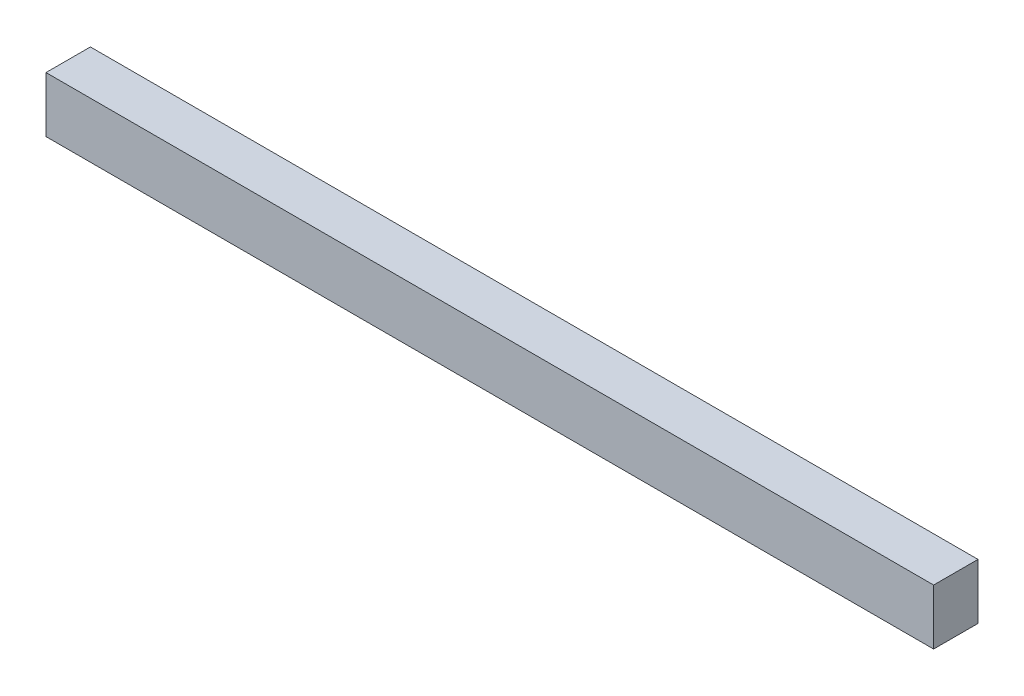
ISO-10303-21;
HEADER;
FILE_DESCRIPTION(('STEP AP214'),'2;1');
FILE_NAME('part.step','',(''),(''),'','','');
FILE_SCHEMA(('AUTOMOTIVE_DESIGN { 1 0 10303 214 1 1 1 1 }'));
ENDSEC;
DATA;
#1=APPLICATION_CONTEXT('core data for automotive mechanical design processes');
#2=APPLICATION_PROTOCOL_DEFINITION('international standard','automotive_design',2000,#1);
#3=PRODUCT_CONTEXT('',#1,'mechanical');
#4=PRODUCT('Part','Part','',(#3));
#5=PRODUCT_RELATED_PRODUCT_CATEGORY('part','',(#4));
#6=PRODUCT_DEFINITION_FORMATION('','',#4);
#7=PRODUCT_DEFINITION_CONTEXT('part definition',#1,'design');
#8=PRODUCT_DEFINITION('design','',#6,#7);
#9=PRODUCT_DEFINITION_SHAPE('','',#8);
#10=(LENGTH_UNIT() NAMED_UNIT(*) SI_UNIT(.MILLI.,.METRE.));
#11=(NAMED_UNIT(*) PLANE_ANGLE_UNIT() SI_UNIT($,.RADIAN.));
#12=(NAMED_UNIT(*) SI_UNIT($,.STERADIAN.) SOLID_ANGLE_UNIT());
#13=UNCERTAINTY_MEASURE_WITH_UNIT(LENGTH_MEASURE(1.E-05),#10,'distance_accuracy_value','');
#14=(GEOMETRIC_REPRESENTATION_CONTEXT(3) GLOBAL_UNCERTAINTY_ASSIGNED_CONTEXT((#13)) GLOBAL_UNIT_ASSIGNED_CONTEXT((#10,
#11,#12)) REPRESENTATION_CONTEXT('',''));
#15=CARTESIAN_POINT('',(0.,0.,0.));
#16=DIRECTION('',(0.,0.,1.));
#17=DIRECTION('',(1.,0.,0.));
#18=AXIS2_PLACEMENT_3D('',#15,#16,#17);
#19=CARTESIAN_POINT('',(-399.999999999999,50.,20.));
#20=DIRECTION('',(1.,0.,0.));
#21=DIRECTION('',(0.,0.,-1.));
#22=AXIS2_PLACEMENT_3D('',#19,#20,#21);
#23=PLANE('',#22);
#24=DIRECTION('',(0.,0.,1.));
#25=VECTOR('',#24,1.);
#26=CARTESIAN_POINT('',(-399.999999999999,0.,20.));
#27=LINE('',#26,#25);
#28=CARTESIAN_POINT('',(-399.999999999999,0.,-19.9999999999999));
#29=VERTEX_POINT('',#28);
#30=CARTESIAN_POINT('',(-399.999999999999,0.,20.));
#31=VERTEX_POINT('',#30);
#32=EDGE_CURVE('E102',#29,#31,#27,.T.);
#33=ORIENTED_EDGE('',*,*,#32,.T.);
#34=DIRECTION('',(0.,-1.,0.));
#35=VECTOR('',#34,1.);
#36=CARTESIAN_POINT('',(-399.999999999999,50.,20.));
#37=LINE('',#36,#35);
#38=CARTESIAN_POINT('',(-399.999999999999,50.,20.));
#39=VERTEX_POINT('',#38);
#40=EDGE_CURVE('E11',#39,#31,#37,.T.);
#41=ORIENTED_EDGE('',*,*,#40,.F.);
#42=DIRECTION('',(0.,0.,1.));
#43=VECTOR('',#42,1.);
#44=CARTESIAN_POINT('',(-399.999999999999,50.,20.));
#45=LINE('',#44,#43);
#46=CARTESIAN_POINT('',(-399.999999999999,50.,-19.9999999999999));
#47=VERTEX_POINT('',#46);
#48=EDGE_CURVE('E90',#47,#39,#45,.T.);
#49=ORIENTED_EDGE('',*,*,#48,.F.);
#50=DIRECTION('',(0.,-1.,0.));
#51=VECTOR('',#50,1.);
#52=CARTESIAN_POINT('',(-399.999999999999,50.,-19.9999999999999));
#53=LINE('',#52,#51);
#54=EDGE_CURVE('E98',#47,#29,#53,.T.);
#55=ORIENTED_EDGE('',*,*,#54,.T.);
#56=EDGE_LOOP('',(#33,#41,#49,#55));
#57=FACE_BOUND('',#56,.T.);
#58=ADVANCED_FACE('F39',(#57),#23,.F.);
#59=CARTESIAN_POINT('',(400.000000000001,50.,20.));
#60=DIRECTION('',(0.,0.,-1.));
#61=DIRECTION('',(-1.,0.,0.));
#62=AXIS2_PLACEMENT_3D('',#59,#60,#61);
#63=PLANE('',#62);
#64=DIRECTION('',(1.,0.,0.));
#65=VECTOR('',#64,1.);
#66=CARTESIAN_POINT('',(400.000000000001,0.,20.));
#67=LINE('',#66,#65);
#68=CARTESIAN_POINT('',(400.000000000001,0.,20.));
#69=VERTEX_POINT('',#68);
#70=EDGE_CURVE('E94',#31,#69,#67,.T.);
#71=ORIENTED_EDGE('',*,*,#70,.T.);
#72=DIRECTION('',(0.,-1.,0.));
#73=VECTOR('',#72,1.);
#74=CARTESIAN_POINT('',(400.000000000001,50.,20.));
#75=LINE('',#74,#73);
#76=CARTESIAN_POINT('',(400.000000000001,50.,20.));
#77=VERTEX_POINT('',#76);
#78=EDGE_CURVE('E47',#77,#69,#75,.T.);
#79=ORIENTED_EDGE('',*,*,#78,.F.);
#80=DIRECTION('',(1.,0.,0.));
#81=VECTOR('',#80,1.);
#82=CARTESIAN_POINT('',(400.000000000001,50.,20.));
#83=LINE('',#82,#81);
#84=EDGE_CURVE('E85',#39,#77,#83,.T.);
#85=ORIENTED_EDGE('',*,*,#84,.F.);
#86=ORIENTED_EDGE('',*,*,#40,.T.);
#87=EDGE_LOOP('',(#71,#79,#85,#86));
#88=FACE_BOUND('',#87,.T.);
#89=ADVANCED_FACE('F93',(#88),#63,.F.);
#90=CARTESIAN_POINT('',(400.000000000001,50.,20.));
#91=DIRECTION('',(-1.,0.,0.));
#92=DIRECTION('',(0.,0.,1.));
#93=AXIS2_PLACEMENT_3D('',#90,#91,#92);
#94=PLANE('',#93);
#95=DIRECTION('',(0.,0.,-1.));
#96=VECTOR('',#95,1.);
#97=CARTESIAN_POINT('',(400.000000000001,0.,20.));
#98=LINE('',#97,#96);
#99=CARTESIAN_POINT('',(400.000000000001,0.,-20.));
#100=VERTEX_POINT('',#99);
#101=EDGE_CURVE('E72',#69,#100,#98,.T.);
#102=ORIENTED_EDGE('',*,*,#101,.T.);
#103=DIRECTION('',(0.,-1.,0.));
#104=VECTOR('',#103,1.);
#105=CARTESIAN_POINT('',(400.000000000001,50.,-20.));
#106=LINE('',#105,#104);
#107=CARTESIAN_POINT('',(400.000000000001,50.,-20.));
#108=VERTEX_POINT('',#107);
#109=EDGE_CURVE('E95',#108,#100,#106,.T.);
#110=ORIENTED_EDGE('',*,*,#109,.F.);
#111=DIRECTION('',(0.,0.,-1.));
#112=VECTOR('',#111,1.);
#113=CARTESIAN_POINT('',(400.000000000001,50.,20.));
#114=LINE('',#113,#112);
#115=EDGE_CURVE('E88',#77,#108,#114,.T.);
#116=ORIENTED_EDGE('',*,*,#115,.F.);
#117=ORIENTED_EDGE('',*,*,#78,.T.);
#118=EDGE_LOOP('',(#102,#110,#116,#117));
#119=FACE_BOUND('',#118,.T.);
#120=ADVANCED_FACE('F96',(#119),#94,.F.);
#121=CARTESIAN_POINT('',(400.000000000001,50.,-20.));
#122=DIRECTION('',(0.,0.,1.));
#123=DIRECTION('',(1.,0.,0.));
#124=AXIS2_PLACEMENT_3D('',#121,#122,#123);
#125=PLANE('',#124);
#126=DIRECTION('',(-1.,0.,0.));
#127=VECTOR('',#126,1.);
#128=CARTESIAN_POINT('',(400.000000000001,0.,-20.));
#129=LINE('',#128,#127);
#130=EDGE_CURVE('E78',#100,#29,#129,.T.);
#131=ORIENTED_EDGE('',*,*,#130,.T.);
#132=ORIENTED_EDGE('',*,*,#54,.F.);
#133=DIRECTION('',(-1.,0.,0.));
#134=VECTOR('',#133,1.);
#135=CARTESIAN_POINT('',(400.000000000001,50.,-20.));
#136=LINE('',#135,#134);
#137=EDGE_CURVE('E55',#108,#47,#136,.T.);
#138=ORIENTED_EDGE('',*,*,#137,.F.);
#139=ORIENTED_EDGE('',*,*,#109,.T.);
#140=EDGE_LOOP('',(#131,#132,#138,#139));
#141=FACE_BOUND('',#140,.T.);
#142=ADVANCED_FACE('F109',(#141),#125,.F.);
#143=CARTESIAN_POINT('',(0.,50.,0.));
#144=DIRECTION('',(0.,1.,0.));
#145=DIRECTION('',(0.,0.,1.));
#146=AXIS2_PLACEMENT_3D('',#143,#144,#145);
#147=PLANE('',#146);
#148=ORIENTED_EDGE('',*,*,#48,.T.);
#149=ORIENTED_EDGE('',*,*,#84,.T.);
#150=ORIENTED_EDGE('',*,*,#115,.T.);
#151=ORIENTED_EDGE('',*,*,#137,.T.);
#152=EDGE_LOOP('',(#148,#149,#150,#151));
#153=FACE_BOUND('',#152,.T.);
#154=ADVANCED_FACE('F86',(#153),#147,.T.);
#155=CARTESIAN_POINT('',(0.,0.,0.));
#156=DIRECTION('',(0.,1.,0.));
#157=DIRECTION('',(0.,0.,1.));
#158=AXIS2_PLACEMENT_3D('',#155,#156,#157);
#159=PLANE('',#158);
#160=ORIENTED_EDGE('',*,*,#32,.F.);
#161=ORIENTED_EDGE('',*,*,#130,.F.);
#162=ORIENTED_EDGE('',*,*,#101,.F.);
#163=ORIENTED_EDGE('',*,*,#70,.F.);
#164=EDGE_LOOP('',(#160,#161,#162,#163));
#165=FACE_BOUND('',#164,.T.);
#166=ADVANCED_FACE('F112',(#165),#159,.F.);
#167=CLOSED_SHELL('',(#58,#89,#120,#142,#154,#166));
#168=MANIFOLD_SOLID_BREP('B2',#167);
#169=ADVANCED_BREP_SHAPE_REPRESENTATION('',(#18,#168),#14);
#170=SHAPE_DEFINITION_REPRESENTATION(#9,#169);
ENDSEC;
END-ISO-10303-21;
